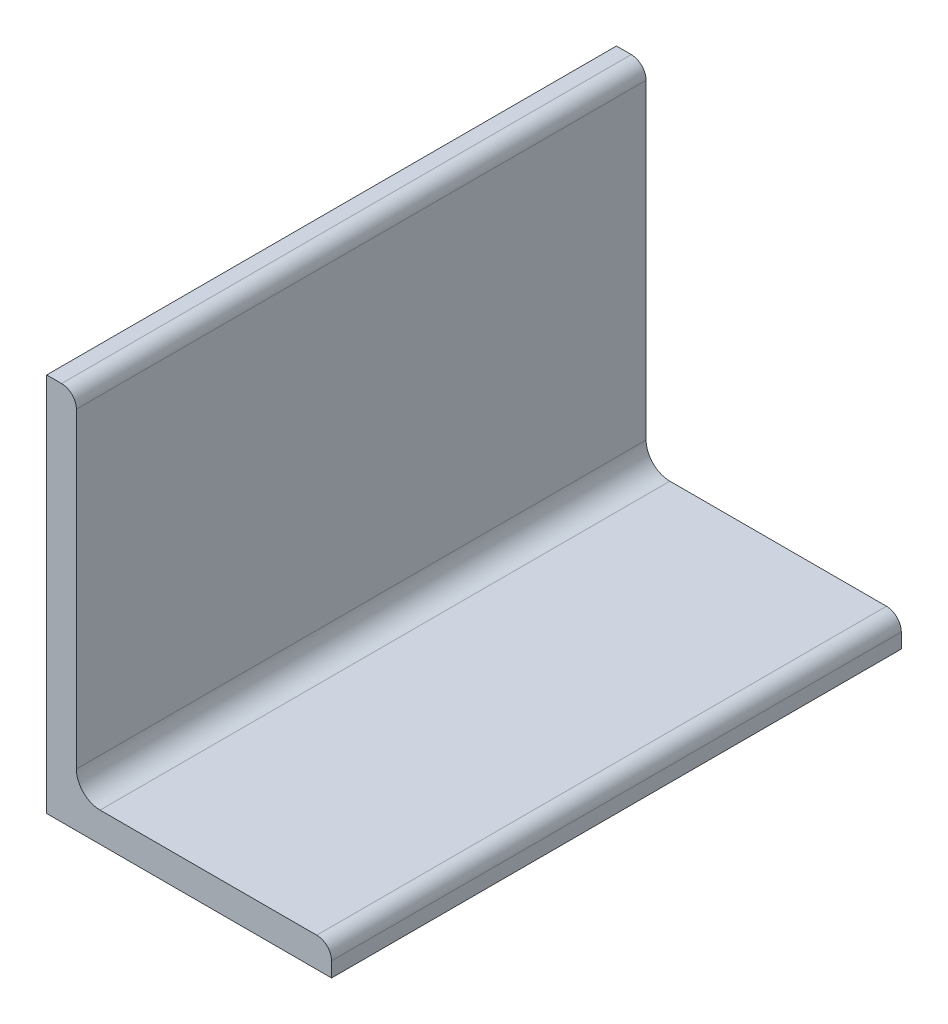
ISO-10303-21;
HEADER;
FILE_DESCRIPTION(('STEP AP214'),'2;1');
FILE_NAME('part.step','',(''),(''),'','','');
FILE_SCHEMA(('AUTOMOTIVE_DESIGN { 1 0 10303 214 1 1 1 1 }'));
ENDSEC;
DATA;
#1=APPLICATION_CONTEXT('core data for automotive mechanical design processes');
#2=APPLICATION_PROTOCOL_DEFINITION('international standard','automotive_design',2000,#1);
#3=PRODUCT_CONTEXT('',#1,'mechanical');
#4=PRODUCT('Part','Part','',(#3));
#5=PRODUCT_RELATED_PRODUCT_CATEGORY('part','',(#4));
#6=PRODUCT_DEFINITION_FORMATION('','',#4);
#7=PRODUCT_DEFINITION_CONTEXT('part definition',#1,'design');
#8=PRODUCT_DEFINITION('design','',#6,#7);
#9=PRODUCT_DEFINITION_SHAPE('','',#8);
#10=(LENGTH_UNIT() NAMED_UNIT(*) SI_UNIT(.MILLI.,.METRE.));
#11=(NAMED_UNIT(*) PLANE_ANGLE_UNIT() SI_UNIT($,.RADIAN.));
#12=(NAMED_UNIT(*) SI_UNIT($,.STERADIAN.) SOLID_ANGLE_UNIT());
#13=UNCERTAINTY_MEASURE_WITH_UNIT(LENGTH_MEASURE(1.E-05),#10,'distance_accuracy_value','');
#14=(GEOMETRIC_REPRESENTATION_CONTEXT(3) GLOBAL_UNCERTAINTY_ASSIGNED_CONTEXT((#13)) GLOBAL_UNIT_ASSIGNED_CONTEXT((#10,
#11,#12)) REPRESENTATION_CONTEXT('',''));
#15=CARTESIAN_POINT('',(0.,0.,0.));
#16=DIRECTION('',(0.,0.,1.));
#17=DIRECTION('',(1.,0.,0.));
#18=AXIS2_PLACEMENT_3D('',#15,#16,#17);
#19=CARTESIAN_POINT('',(0.425014111727251,203.678837479772,304.8));
#20=DIRECTION('',(1.,0.,0.));
#21=DIRECTION('',(0.,0.,-1.));
#22=AXIS2_PLACEMENT_3D('',#19,#20,#21);
#23=PLANE('',#22);
#24=DIRECTION('',(0.,-1.,0.));
#25=VECTOR('',#24,1.);
#26=CARTESIAN_POINT('',(0.425014111727251,203.678837479772,0.));
#27=LINE('',#26,#25);
#28=CARTESIAN_POINT('',(0.425014111727251,203.678837479772,0.));
#29=VERTEX_POINT('',#28);
#30=CARTESIAN_POINT('',(0.425014111727251,0.478837479771528,0.));
#31=VERTEX_POINT('',#30);
#32=EDGE_CURVE('E135',#29,#31,#27,.T.);
#33=ORIENTED_EDGE('',*,*,#32,.T.);
#34=DIRECTION('',(0.,0.,-1.));
#35=VECTOR('',#34,1.);
#36=CARTESIAN_POINT('',(0.425014111727251,0.478837479771528,304.8));
#37=LINE('',#36,#35);
#38=CARTESIAN_POINT('',(0.425014111727251,0.478837479771528,304.8));
#39=VERTEX_POINT('',#38);
#40=EDGE_CURVE('E11',#39,#31,#37,.T.);
#41=ORIENTED_EDGE('',*,*,#40,.F.);
#42=DIRECTION('',(0.,-1.,0.));
#43=VECTOR('',#42,1.);
#44=CARTESIAN_POINT('',(0.425014111727251,203.678837479772,304.8));
#45=LINE('',#44,#43);
#46=CARTESIAN_POINT('',(0.425014111727251,203.678837479772,304.8));
#47=VERTEX_POINT('',#46);
#48=EDGE_CURVE('E151',#47,#39,#45,.T.);
#49=ORIENTED_EDGE('',*,*,#48,.F.);
#50=DIRECTION('',(0.,0.,-1.));
#51=VECTOR('',#50,1.);
#52=CARTESIAN_POINT('',(0.425014111727251,203.678837479772,304.8));
#53=LINE('',#52,#51);
#54=EDGE_CURVE('E131',#47,#29,#53,.T.);
#55=ORIENTED_EDGE('',*,*,#54,.T.);
#56=EDGE_LOOP('',(#33,#41,#49,#55));
#57=FACE_BOUND('',#56,.T.);
#58=ADVANCED_FACE('F33',(#57),#23,.F.);
#59=CARTESIAN_POINT('',(0.425014111727251,0.478837479771528,304.8));
#60=DIRECTION('',(0.,1.,0.));
#61=DIRECTION('',(0.,0.,1.));
#62=AXIS2_PLACEMENT_3D('',#59,#60,#61);
#63=PLANE('',#62);
#64=DIRECTION('',(1.,0.,0.));
#65=VECTOR('',#64,1.);
#66=CARTESIAN_POINT('',(0.425014111727251,0.478837479771528,0.));
#67=LINE('',#66,#65);
#68=CARTESIAN_POINT('',(152.825014111727,0.478837479771528,0.));
#69=VERTEX_POINT('',#68);
#70=EDGE_CURVE('E138',#31,#69,#67,.T.);
#71=ORIENTED_EDGE('',*,*,#70,.T.);
#72=DIRECTION('',(0.,0.,-1.));
#73=VECTOR('',#72,1.);
#74=CARTESIAN_POINT('',(152.825014111727,0.478837479771528,304.8));
#75=LINE('',#74,#73);
#76=CARTESIAN_POINT('',(152.825014111727,0.478837479771528,304.8));
#77=VERTEX_POINT('',#76);
#78=EDGE_CURVE('E41',#77,#69,#75,.T.);
#79=ORIENTED_EDGE('',*,*,#78,.F.);
#80=DIRECTION('',(1.,0.,0.));
#81=VECTOR('',#80,1.);
#82=CARTESIAN_POINT('',(0.425014111727251,0.478837479771528,304.8));
#83=LINE('',#82,#81);
#84=EDGE_CURVE('E95',#39,#77,#83,.T.);
#85=ORIENTED_EDGE('',*,*,#84,.F.);
#86=ORIENTED_EDGE('',*,*,#40,.T.);
#87=EDGE_LOOP('',(#71,#79,#85,#86));
#88=FACE_BOUND('',#87,.T.);
#89=ADVANCED_FACE('F194',(#88),#63,.F.);
#90=CARTESIAN_POINT('',(152.825014111727,0.478837479771528,304.8));
#91=DIRECTION('',(-1.,0.,0.));
#92=DIRECTION('',(0.,0.,1.));
#93=AXIS2_PLACEMENT_3D('',#90,#91,#92);
#94=PLANE('',#93);
#95=DIRECTION('',(0.,1.,0.));
#96=VECTOR('',#95,1.);
#97=CARTESIAN_POINT('',(152.825014111727,0.478837479771528,0.));
#98=LINE('',#97,#96);
#99=CARTESIAN_POINT('',(152.825014111727,8.41633747977153,0.));
#100=VERTEX_POINT('',#99);
#101=EDGE_CURVE('E140',#69,#100,#98,.T.);
#102=ORIENTED_EDGE('',*,*,#101,.T.);
#103=DIRECTION('',(0.,0.,-1.));
#104=VECTOR('',#103,1.);
#105=CARTESIAN_POINT('',(152.825014111727,8.41633747977153,304.8));
#106=LINE('',#105,#104);
#107=CARTESIAN_POINT('',(152.825014111727,8.41633747977153,304.8));
#108=VERTEX_POINT('',#107);
#109=EDGE_CURVE('E161',#108,#100,#106,.T.);
#110=ORIENTED_EDGE('',*,*,#109,.F.);
#111=DIRECTION('',(0.,1.,0.));
#112=VECTOR('',#111,1.);
#113=CARTESIAN_POINT('',(152.825014111727,0.478837479771528,304.8));
#114=LINE('',#113,#112);
#115=EDGE_CURVE('E169',#77,#108,#114,.T.);
#116=ORIENTED_EDGE('',*,*,#115,.F.);
#117=ORIENTED_EDGE('',*,*,#78,.T.);
#118=EDGE_LOOP('',(#102,#110,#116,#117));
#119=FACE_BOUND('',#118,.T.);
#120=ADVANCED_FACE('F167',(#119),#94,.F.);
#121=CARTESIAN_POINT('',(144.887514111727,8.41633747977152,304.8));
#122=DIRECTION('',(0.,0.,-1.));
#123=DIRECTION('',(-1.,0.,0.));
#124=AXIS2_PLACEMENT_3D('',#121,#122,#123);
#125=CYLINDRICAL_SURFACE('',#124,7.93750000000001);
#126=CARTESIAN_POINT('',(144.887514111727,8.41633747977152,0.));
#127=DIRECTION('',(0.,0.,1.));
#128=DIRECTION('',(1.,0.,0.));
#129=AXIS2_PLACEMENT_3D('',#126,#127,#128);
#130=CIRCLE('',#129,7.93750000000001);
#131=CARTESIAN_POINT('',(144.887514111727,16.3538374797715,0.));
#132=VERTEX_POINT('',#131);
#133=EDGE_CURVE('E142',#100,#132,#130,.T.);
#134=ORIENTED_EDGE('',*,*,#133,.T.);
#135=DIRECTION('',(0.,0.,-1.));
#136=VECTOR('',#135,1.);
#137=CARTESIAN_POINT('',(144.887514111727,16.3538374797715,304.8));
#138=LINE('',#137,#136);
#139=CARTESIAN_POINT('',(144.887514111727,16.3538374797715,304.8));
#140=VERTEX_POINT('',#139);
#141=EDGE_CURVE('E158',#140,#132,#138,.T.);
#142=ORIENTED_EDGE('',*,*,#141,.F.);
#143=CARTESIAN_POINT('',(144.887514111727,8.41633747977152,304.8));
#144=DIRECTION('',(0.,0.,1.));
#145=DIRECTION('',(1.,0.,0.));
#146=AXIS2_PLACEMENT_3D('',#143,#144,#145);
#147=CIRCLE('',#146,7.93750000000001);
#148=EDGE_CURVE('E185',#108,#140,#147,.T.);
#149=ORIENTED_EDGE('',*,*,#148,.F.);
#150=ORIENTED_EDGE('',*,*,#109,.T.);
#151=EDGE_LOOP('',(#134,#142,#149,#150));
#152=FACE_BOUND('',#151,.T.);
#153=ADVANCED_FACE('F178',(#152),#125,.T.);
#154=CARTESIAN_POINT('',(144.887514111727,16.3538374797715,304.8));
#155=DIRECTION('',(0.,-1.,0.));
#156=DIRECTION('',(0.,0.,-1.));
#157=AXIS2_PLACEMENT_3D('',#154,#155,#156);
#158=PLANE('',#157);
#159=DIRECTION('',(-1.,0.,0.));
#160=VECTOR('',#159,1.);
#161=CARTESIAN_POINT('',(144.887514111727,16.3538374797715,0.));
#162=LINE('',#161,#160);
#163=CARTESIAN_POINT('',(29.0000141117272,16.3538374797715,0.));
#164=VERTEX_POINT('',#163);
#165=EDGE_CURVE('E144',#132,#164,#162,.T.);
#166=ORIENTED_EDGE('',*,*,#165,.T.);
#167=DIRECTION('',(0.,0.,-1.));
#168=VECTOR('',#167,1.);
#169=CARTESIAN_POINT('',(29.0000141117272,16.3538374797715,304.8));
#170=LINE('',#169,#168);
#171=CARTESIAN_POINT('',(29.0000141117272,16.3538374797715,304.8));
#172=VERTEX_POINT('',#171);
#173=EDGE_CURVE('E155',#172,#164,#170,.T.);
#174=ORIENTED_EDGE('',*,*,#173,.F.);
#175=DIRECTION('',(-1.,0.,0.));
#176=VECTOR('',#175,1.);
#177=CARTESIAN_POINT('',(144.887514111727,16.3538374797715,304.8));
#178=LINE('',#177,#176);
#179=EDGE_CURVE('E184',#140,#172,#178,.T.);
#180=ORIENTED_EDGE('',*,*,#179,.F.);
#181=ORIENTED_EDGE('',*,*,#141,.T.);
#182=EDGE_LOOP('',(#166,#174,#180,#181));
#183=FACE_BOUND('',#182,.T.);
#184=ADVANCED_FACE('F182',(#183),#158,.F.);
#185=CARTESIAN_POINT('',(29.0000141117272,29.0538374797715,304.8));
#186=DIRECTION('',(0.,0.,-1.));
#187=DIRECTION('',(-1.,0.,0.));
#188=AXIS2_PLACEMENT_3D('',#185,#186,#187);
#189=CYLINDRICAL_SURFACE('',#188,12.7);
#190=CARTESIAN_POINT('',(29.0000141117272,29.0538374797715,0.));
#191=DIRECTION('',(0.,0.,-1.));
#192=DIRECTION('',(1.,0.,0.));
#193=AXIS2_PLACEMENT_3D('',#190,#191,#192);
#194=CIRCLE('',#193,12.7);
#195=CARTESIAN_POINT('',(16.3000141117272,29.0538374797715,0.));
#196=VERTEX_POINT('',#195);
#197=EDGE_CURVE('E146',#164,#196,#194,.T.);
#198=ORIENTED_EDGE('',*,*,#197,.T.);
#199=DIRECTION('',(0.,0.,-1.));
#200=VECTOR('',#199,1.);
#201=CARTESIAN_POINT('',(16.3000141117272,29.0538374797715,304.8));
#202=LINE('',#201,#200);
#203=CARTESIAN_POINT('',(16.3000141117272,29.0538374797715,304.8));
#204=VERTEX_POINT('',#203);
#205=EDGE_CURVE('E126',#204,#196,#202,.T.);
#206=ORIENTED_EDGE('',*,*,#205,.F.);
#207=CARTESIAN_POINT('',(29.0000141117272,29.0538374797715,304.8));
#208=DIRECTION('',(0.,0.,-1.));
#209=DIRECTION('',(1.,0.,0.));
#210=AXIS2_PLACEMENT_3D('',#207,#208,#209);
#211=CIRCLE('',#210,12.7);
#212=EDGE_CURVE('E117',#172,#204,#211,.T.);
#213=ORIENTED_EDGE('',*,*,#212,.F.);
#214=ORIENTED_EDGE('',*,*,#173,.T.);
#215=EDGE_LOOP('',(#198,#206,#213,#214));
#216=FACE_BOUND('',#215,.T.);
#217=ADVANCED_FACE('F206',(#216),#189,.F.);
#218=CARTESIAN_POINT('',(16.3000141117273,29.0538374797715,304.8));
#219=DIRECTION('',(-1.,0.,0.));
#220=DIRECTION('',(0.,0.,1.));
#221=AXIS2_PLACEMENT_3D('',#218,#219,#220);
#222=PLANE('',#221);
#223=DIRECTION('',(0.,1.,0.));
#224=VECTOR('',#223,1.);
#225=CARTESIAN_POINT('',(16.3000141117273,29.0538374797715,0.));
#226=LINE('',#225,#224);
#227=CARTESIAN_POINT('',(16.3000141117273,195.741337479772,0.));
#228=VERTEX_POINT('',#227);
#229=EDGE_CURVE('E125',#196,#228,#226,.T.);
#230=ORIENTED_EDGE('',*,*,#229,.T.);
#231=DIRECTION('',(0.,0.,-1.));
#232=VECTOR('',#231,1.);
#233=CARTESIAN_POINT('',(16.3000141117273,195.741337479772,304.8));
#234=LINE('',#233,#232);
#235=CARTESIAN_POINT('',(16.3000141117273,195.741337479772,304.8));
#236=VERTEX_POINT('',#235);
#237=EDGE_CURVE('E122',#236,#228,#234,.T.);
#238=ORIENTED_EDGE('',*,*,#237,.F.);
#239=DIRECTION('',(0.,1.,0.));
#240=VECTOR('',#239,1.);
#241=CARTESIAN_POINT('',(16.3000141117273,29.0538374797715,304.8));
#242=LINE('',#241,#240);
#243=EDGE_CURVE('E111',#204,#236,#242,.T.);
#244=ORIENTED_EDGE('',*,*,#243,.F.);
#245=ORIENTED_EDGE('',*,*,#205,.T.);
#246=EDGE_LOOP('',(#230,#238,#244,#245));
#247=FACE_BOUND('',#246,.T.);
#248=ADVANCED_FACE('F123',(#247),#222,.F.);
#249=CARTESIAN_POINT('',(8.36251411172725,195.741337479772,304.8));
#250=DIRECTION('',(0.,0.,-1.));
#251=DIRECTION('',(-1.,0.,0.));
#252=AXIS2_PLACEMENT_3D('',#249,#250,#251);
#253=CYLINDRICAL_SURFACE('',#252,7.93749999999999);
#254=CARTESIAN_POINT('',(8.36251411172725,195.741337479772,0.));
#255=DIRECTION('',(0.,0.,1.));
#256=DIRECTION('',(1.,0.,0.));
#257=AXIS2_PLACEMENT_3D('',#254,#255,#256);
#258=CIRCLE('',#257,7.93749999999999);
#259=CARTESIAN_POINT('',(8.36251411172725,203.678837479772,0.));
#260=VERTEX_POINT('',#259);
#261=EDGE_CURVE('E81',#228,#260,#258,.T.);
#262=ORIENTED_EDGE('',*,*,#261,.T.);
#263=DIRECTION('',(0.,0.,-1.));
#264=VECTOR('',#263,1.);
#265=CARTESIAN_POINT('',(8.36251411172725,203.678837479772,304.8));
#266=LINE('',#265,#264);
#267=CARTESIAN_POINT('',(8.36251411172725,203.678837479772,304.8));
#268=VERTEX_POINT('',#267);
#269=EDGE_CURVE('E127',#268,#260,#266,.T.);
#270=ORIENTED_EDGE('',*,*,#269,.F.);
#271=CARTESIAN_POINT('',(8.36251411172725,195.741337479772,304.8));
#272=DIRECTION('',(0.,0.,1.));
#273=DIRECTION('',(1.,0.,0.));
#274=AXIS2_PLACEMENT_3D('',#271,#272,#273);
#275=CIRCLE('',#274,7.93749999999999);
#276=EDGE_CURVE('E115',#236,#268,#275,.T.);
#277=ORIENTED_EDGE('',*,*,#276,.F.);
#278=ORIENTED_EDGE('',*,*,#237,.T.);
#279=EDGE_LOOP('',(#262,#270,#277,#278));
#280=FACE_BOUND('',#279,.T.);
#281=ADVANCED_FACE('F129',(#280),#253,.T.);
#282=CARTESIAN_POINT('',(8.36251411172725,203.678837479772,304.8));
#283=DIRECTION('',(0.,-1.,0.));
#284=DIRECTION('',(0.,0.,-1.));
#285=AXIS2_PLACEMENT_3D('',#282,#283,#284);
#286=PLANE('',#285);
#287=DIRECTION('',(-1.,0.,0.));
#288=VECTOR('',#287,1.);
#289=CARTESIAN_POINT('',(8.36251411172725,203.678837479772,0.));
#290=LINE('',#289,#288);
#291=EDGE_CURVE('E87',#260,#29,#290,.T.);
#292=ORIENTED_EDGE('',*,*,#291,.T.);
#293=ORIENTED_EDGE('',*,*,#54,.F.);
#294=DIRECTION('',(-1.,0.,0.));
#295=VECTOR('',#294,1.);
#296=CARTESIAN_POINT('',(8.36251411172725,203.678837479772,304.8));
#297=LINE('',#296,#295);
#298=EDGE_CURVE('E49',#268,#47,#297,.T.);
#299=ORIENTED_EDGE('',*,*,#298,.F.);
#300=ORIENTED_EDGE('',*,*,#269,.T.);
#301=EDGE_LOOP('',(#292,#293,#299,#300));
#302=FACE_BOUND('',#301,.T.);
#303=ADVANCED_FACE('F214',(#302),#286,.F.);
#304=CARTESIAN_POINT('',(144.887514111727,8.41633747977152,304.8));
#305=DIRECTION('',(0.,0.,1.));
#306=DIRECTION('',(1.,0.,0.));
#307=AXIS2_PLACEMENT_3D('',#304,#305,#306);
#308=PLANE('',#307);
#309=ORIENTED_EDGE('',*,*,#48,.T.);
#310=ORIENTED_EDGE('',*,*,#84,.T.);
#311=ORIENTED_EDGE('',*,*,#115,.T.);
#312=ORIENTED_EDGE('',*,*,#148,.T.);
#313=ORIENTED_EDGE('',*,*,#179,.T.);
#314=ORIENTED_EDGE('',*,*,#212,.T.);
#315=ORIENTED_EDGE('',*,*,#243,.T.);
#316=ORIENTED_EDGE('',*,*,#276,.T.);
#317=ORIENTED_EDGE('',*,*,#298,.T.);
#318=EDGE_LOOP('',(#309,#310,#311,#312,#313,#314,#315,#316,#317));
#319=FACE_BOUND('',#318,.T.);
#320=ADVANCED_FACE('F113',(#319),#308,.T.);
#321=CARTESIAN_POINT('',(144.887514111727,8.41633747977152,0.));
#322=DIRECTION('',(0.,0.,1.));
#323=DIRECTION('',(1.,0.,0.));
#324=AXIS2_PLACEMENT_3D('',#321,#322,#323);
#325=PLANE('',#324);
#326=ORIENTED_EDGE('',*,*,#32,.F.);
#327=ORIENTED_EDGE('',*,*,#291,.F.);
#328=ORIENTED_EDGE('',*,*,#261,.F.);
#329=ORIENTED_EDGE('',*,*,#229,.F.);
#330=ORIENTED_EDGE('',*,*,#197,.F.);
#331=ORIENTED_EDGE('',*,*,#165,.F.);
#332=ORIENTED_EDGE('',*,*,#133,.F.);
#333=ORIENTED_EDGE('',*,*,#101,.F.);
#334=ORIENTED_EDGE('',*,*,#70,.F.);
#335=EDGE_LOOP('',(#326,#327,#328,#329,#330,#331,#332,#333,#334));
#336=FACE_BOUND('',#335,.T.);
#337=ADVANCED_FACE('F173',(#336),#325,.F.);
#338=CLOSED_SHELL('',(#58,#89,#120,#153,#184,#217,#248,#281,#303,#320,#337));
#339=MANIFOLD_SOLID_BREP('B2',#338);
#340=ADVANCED_BREP_SHAPE_REPRESENTATION('',(#18,#339),#14);
#341=SHAPE_DEFINITION_REPRESENTATION(#9,#340);
ENDSEC;
END-ISO-10303-21;
